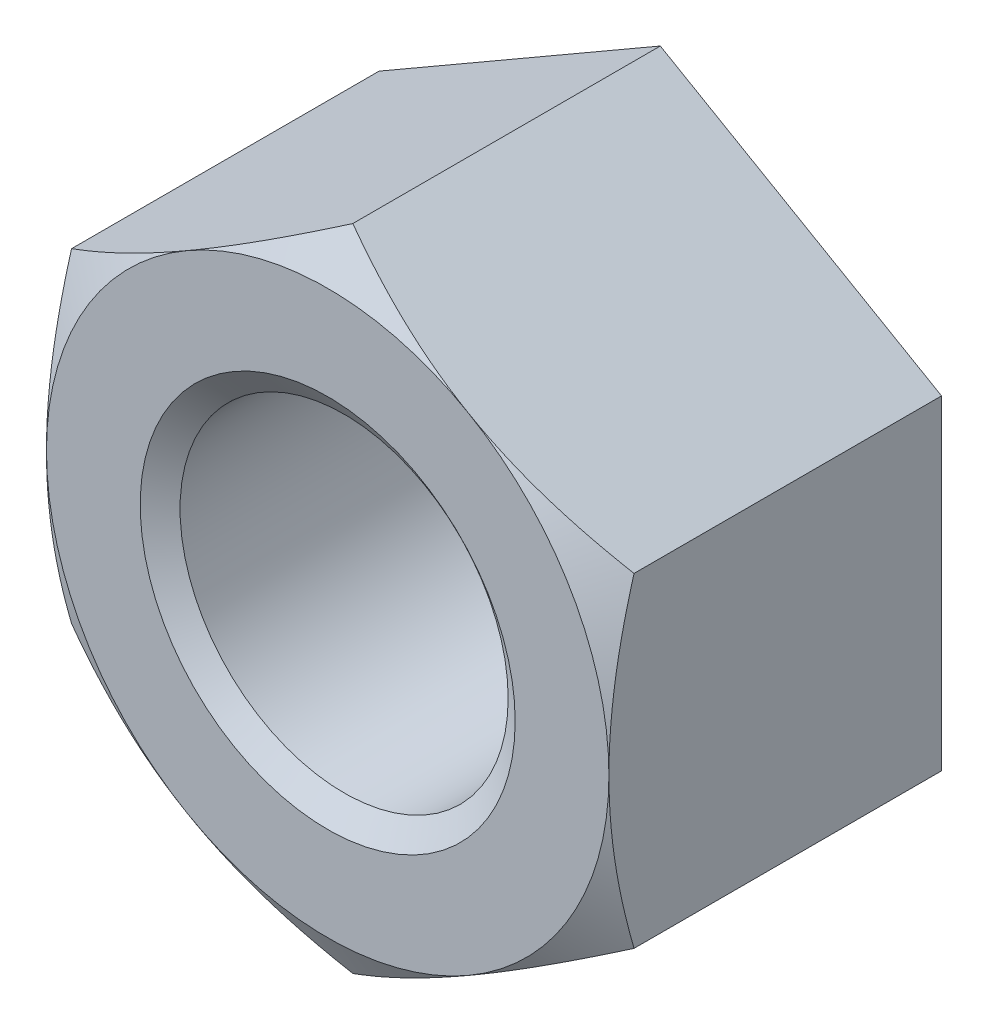
ISO-10303-21;
HEADER;
FILE_DESCRIPTION(('STEP AP214'),'2;1');
FILE_NAME('part.step','',(''),(''),'','','');
FILE_SCHEMA(('AUTOMOTIVE_DESIGN { 1 0 10303 214 1 1 1 1 }'));
ENDSEC;
DATA;
#1=APPLICATION_CONTEXT('core data for automotive mechanical design processes');
#2=APPLICATION_PROTOCOL_DEFINITION('international standard','automotive_design',2000,#1);
#3=PRODUCT_CONTEXT('',#1,'mechanical');
#4=PRODUCT('Part','Part','',(#3));
#5=PRODUCT_RELATED_PRODUCT_CATEGORY('part','',(#4));
#6=PRODUCT_DEFINITION_FORMATION('','',#4);
#7=PRODUCT_DEFINITION_CONTEXT('part definition',#1,'design');
#8=PRODUCT_DEFINITION('design','',#6,#7);
#9=PRODUCT_DEFINITION_SHAPE('','',#8);
#10=(LENGTH_UNIT() NAMED_UNIT(*) SI_UNIT(.MILLI.,.METRE.));
#11=(NAMED_UNIT(*) PLANE_ANGLE_UNIT() SI_UNIT($,.RADIAN.));
#12=(NAMED_UNIT(*) SI_UNIT($,.STERADIAN.) SOLID_ANGLE_UNIT());
#13=UNCERTAINTY_MEASURE_WITH_UNIT(LENGTH_MEASURE(1.E-05),#10,'distance_accuracy_value','');
#14=(GEOMETRIC_REPRESENTATION_CONTEXT(3) GLOBAL_UNCERTAINTY_ASSIGNED_CONTEXT((#13)) GLOBAL_UNIT_ASSIGNED_CONTEXT((#10,
#11,#12)) REPRESENTATION_CONTEXT('',''));
#15=CARTESIAN_POINT('',(0.,0.,0.));
#16=DIRECTION('',(0.,0.,1.));
#17=DIRECTION('',(1.,0.,0.));
#18=AXIS2_PLACEMENT_3D('',#15,#16,#17);
#19=CARTESIAN_POINT('',(0.,0.,-22.5298));
#20=DIRECTION('',(0.,0.,1.));
#21=DIRECTION('',(1.,0.,0.));
#22=AXIS2_PLACEMENT_3D('',#19,#20,#21);
#23=CYLINDRICAL_SURFACE('',#22,11.1125);
#24=CARTESIAN_POINT('',(0.,0.,-1.11157946690791));
#25=DIRECTION('',(0.,0.,1.));
#26=DIRECTION('',(1.,0.,0.));
#27=AXIS2_PLACEMENT_3D('',#24,#25,#26);
#28=CIRCLE('',#27,11.1125);
#29=CARTESIAN_POINT('',(11.1125,0.,-1.11157946690791));
#30=VERTEX_POINT('',#29);
#31=EDGE_CURVE('E129',#30,#30,#28,.F.);
#32=ORIENTED_EDGE('',*,*,#31,.F.);
#33=EDGE_LOOP('',(#32));
#34=FACE_BOUND('',#33,.T.);
#35=CARTESIAN_POINT('',(0.,0.,-21.3928205330921));
#36=DIRECTION('',(0.,0.,-1.));
#37=DIRECTION('',(-1.,0.,0.));
#38=AXIS2_PLACEMENT_3D('',#35,#36,#37);
#39=CIRCLE('',#38,11.1125);
#40=CARTESIAN_POINT('',(-11.1125,0.,-21.3928205330921));
#41=VERTEX_POINT('',#40);
#42=EDGE_CURVE('E39',#41,#41,#39,.F.);
#43=ORIENTED_EDGE('',*,*,#42,.F.);
#44=EDGE_LOOP('',(#43));
#45=FACE_BOUND('',#44,.T.);
#46=ADVANCED_FACE('F34',(#34,#45),#23,.F.);
#47=CARTESIAN_POINT('',(0.,21.9970452561248,-22.5298));
#48=DIRECTION('',(-0.500000000000001,0.866025403784438,0.));
#49=DIRECTION('',(-0.866025403784438,-0.500000000000001,0.));
#50=AXIS2_PLACEMENT_3D('',#47,#48,#49);
#51=PLANE('',#50);
#52=DIRECTION('',(0.,0.,1.));
#53=VECTOR('',#52,1.);
#54=CARTESIAN_POINT('',(-19.05,10.9985226280624,-22.5298));
#55=LINE('',#54,#53);
#56=CARTESIAN_POINT('',(-19.05,10.9985226280624,-22.5298));
#57=VERTEX_POINT('',#56);
#58=CARTESIAN_POINT('',(-19.05,10.9985226280624,-1.70147737193762));
#59=VERTEX_POINT('',#58);
#60=EDGE_CURVE('E235',#57,#59,#55,.T.);
#61=ORIENTED_EDGE('',*,*,#60,.T.);
#62=CARTESIAN_POINT('',(-19.0502,10.9984071580085,-1.70154403912922));
#63=CARTESIAN_POINT('',(-18.6314889424188,11.2401500998157,-1.56198341710823));
#64=CARTESIAN_POINT('',(-18.2111446870423,11.4828359688097,-1.42875584552932));
#65=CARTESIAN_POINT('',(-17.3670855155916,11.9701537586587,-1.17672716507821));
#66=CARTESIAN_POINT('',(-16.9433695394589,12.2147862915388,-1.05793080103127));
#67=CARTESIAN_POINT('',(-16.0917480208183,12.7064702045736,-0.836361403470761));
#68=CARTESIAN_POINT('',(-15.6638350258304,12.9535258874196,-0.733626282713286));
#69=CARTESIAN_POINT('',(-14.8050356703556,13.4493539264829,-0.54638543408781));
#70=CARTESIAN_POINT('',(-14.374149481613,13.6981261835436,-0.461878662220414));
#71=CARTESIAN_POINT('',(-13.5204444881885,14.1910129913057,-0.314688827717638));
#72=CARTESIAN_POINT('',(-13.0976890621094,14.4350909503539,-0.2515185920053));
#73=CARTESIAN_POINT('',(-12.250241089937,14.9243652652118,-0.145596345015129));
#74=CARTESIAN_POINT('',(-11.8255485067157,15.1695616424575,-0.102844726760489));
#75=CARTESIAN_POINT('',(-10.9754499399404,15.6603662788229,-0.0388391678998634));
#76=CARTESIAN_POINT('',(-10.5500454086646,15.9059736994695,-0.0175596817216179));
#77=CARTESIAN_POINT('',(-9.6988436900556,16.397415240843,0.00304398488097226));
#78=CARTESIAN_POINT('',(-9.27304651526214,16.6432493543302,0.00236884372942893));
#79=CARTESIAN_POINT('',(-8.47700964232625,17.1028414572046,-0.0194033988503004));
#80=CARTESIAN_POINT('',(-8.10671322507253,17.316632193386,-0.0378455699352581));
#81=CARTESIAN_POINT('',(-7.36700369103291,17.7437036919859,-0.0909844304102484));
#82=CARTESIAN_POINT('',(-6.99759056167259,17.9569844616643,-0.125680887003944));
#83=CARTESIAN_POINT('',(-6.25978756382388,18.3829552210812,-0.210726274890312));
#84=CARTESIAN_POINT('',(-5.89139892582437,18.5956445003966,-0.261089360566665));
#85=CARTESIAN_POINT('',(-5.15637533457961,19.0200105686625,-0.376579300829338));
#86=CARTESIAN_POINT('',(-4.78974037391031,19.2316873618992,-0.441706092858125));
#87=CARTESIAN_POINT('',(-3.67677271593589,19.8742595388301,-0.660888399543253));
#88=CARTESIAN_POINT('',(-2.93366305060603,20.3032941041457,-0.836799169320445));
#89=CARTESIAN_POINT('',(-1.45852420538159,21.1549659135281,-1.23604434094318));
#90=CARTESIAN_POINT('',(-0.726476139694541,21.5776140613123,-1.45928498251532));
#91=CARTESIAN_POINT('',(0.000200000000000728,21.9971607261786,-1.70154403912923));
#92=B_SPLINE_CURVE_WITH_KNOTS('',3,(#62,#63,#64,#65,#66,#67,#68,#69,#70,#71,#72,#73,#74,#75,#76,
#77,#78,#79,#80,#81,#82,#83,#84,#85,#86,#87,#88,#89,#90,#91),.UNSPECIFIED.,.F.,.F.,(4,2,2,2,2,2,
2,2,2,2,2,2,2,2,4),(0.,1.50971559281794,3.01992622800797,4.53364959201314,6.04728623691164,
7.52356313869613,8.99986845512143,10.4744153207586,11.9489166211861,13.2325441548787,
14.5161533048254,15.8009255464228,17.085692344219,19.7118183650732,22.3327898553892),.UNSPECIFIED.);
#93=CARTESIAN_POINT('',(-9.52500000000002,16.4977839420936,0.));
#94=VERTEX_POINT('',#93);
#95=EDGE_CURVE('E61',#59,#94,#92,.T.);
#96=ORIENTED_EDGE('',*,*,#95,.T.);
#97=CARTESIAN_POINT('',(0.,21.9970452561248,-1.70147737193764));
#98=VERTEX_POINT('',#97);
#99=EDGE_CURVE('E121',#94,#98,#92,.T.);
#100=ORIENTED_EDGE('',*,*,#99,.T.);
#101=DIRECTION('',(0.,0.,1.));
#102=VECTOR('',#101,1.);
#103=CARTESIAN_POINT('',(0.,21.9970452561248,-22.5298));
#104=LINE('',#103,#102);
#105=CARTESIAN_POINT('',(0.,21.9970452561248,-22.5298));
#106=VERTEX_POINT('',#105);
#107=EDGE_CURVE('E134',#106,#98,#104,.T.);
#108=ORIENTED_EDGE('',*,*,#107,.F.);
#109=DIRECTION('',(-0.866025403784438,-0.500000000000001,0.));
#110=VECTOR('',#109,1.);
#111=CARTESIAN_POINT('',(0.,21.9970452561248,-22.5298));
#112=LINE('',#111,#110);
#113=EDGE_CURVE('E135',#106,#57,#112,.T.);
#114=ORIENTED_EDGE('',*,*,#113,.T.);
#115=EDGE_LOOP('',(#61,#96,#100,#108,#114));
#116=FACE_BOUND('',#115,.T.);
#117=ADVANCED_FACE('F36',(#116),#51,.T.);
#118=CARTESIAN_POINT('',(19.05,10.9985226280624,-22.5298));
#119=DIRECTION('',(0.500000000000001,0.866025403784438,0.));
#120=DIRECTION('',(-0.866025403784438,0.500000000000001,0.));
#121=AXIS2_PLACEMENT_3D('',#118,#119,#120);
#122=PLANE('',#121);
#123=ORIENTED_EDGE('',*,*,#107,.T.);
#124=CARTESIAN_POINT('',(-0.000200000000000468,21.9971607261786,-1.70154403912923));
#125=CARTESIAN_POINT('',(0.418511057581223,21.7554177843714,-1.56198341710824));
#126=CARTESIAN_POINT('',(0.83885531295774,21.5127319153775,-1.42875584552934));
#127=CARTESIAN_POINT('',(1.68291448440842,21.0254141255284,-1.17672716507822));
#128=CARTESIAN_POINT('',(2.10663046054107,20.7807815926483,-1.05793080103129));
#129=CARTESIAN_POINT('',(2.95825197918165,20.2890976796135,-0.83636140347077));
#130=CARTESIAN_POINT('',(3.38616497416957,20.0420419967675,-0.733626282713294));
#131=CARTESIAN_POINT('',(4.24496432964444,19.5462139577042,-0.546385434087818));
#132=CARTESIAN_POINT('',(4.67585051838703,19.2974417006435,-0.461878662220422));
#133=CARTESIAN_POINT('',(5.52955551181151,18.8045548928814,-0.314688827717644));
#134=CARTESIAN_POINT('',(5.95231093789063,18.5604769338332,-0.251518592005304));
#135=CARTESIAN_POINT('',(6.79975891006299,18.0712026189753,-0.145596345015133));
#136=CARTESIAN_POINT('',(7.22445149328435,17.8260062417296,-0.102844726760493));
#137=CARTESIAN_POINT('',(8.07455006005964,17.3352016053642,-0.0388391678998658));
#138=CARTESIAN_POINT('',(8.49995459133542,17.0895941847176,-0.0175596817216192));
#139=CARTESIAN_POINT('',(9.35115630994441,16.5981526433441,0.00304398488097248));
#140=CARTESIAN_POINT('',(9.77695348473788,16.3523185298569,0.00236884372942956));
#141=CARTESIAN_POINT('',(10.5729903576738,15.8927264269825,-0.0194033988502991));
#142=CARTESIAN_POINT('',(10.9432867749275,15.6789356908011,-0.0378455699352566));
#143=CARTESIAN_POINT('',(11.6829963089671,15.2518641922012,-0.0909844304102459));
#144=CARTESIAN_POINT('',(12.0524094383274,15.0385834225228,-0.12568088700394));
#145=CARTESIAN_POINT('',(12.7902124361761,14.612612663106,-0.210726274890308));
#146=CARTESIAN_POINT('',(13.1586010741756,14.3999233837905,-0.261089360566661));
#147=CARTESIAN_POINT('',(13.8936246654204,13.9755573155246,-0.376579300829333));
#148=CARTESIAN_POINT('',(14.2602596260897,13.7638805222879,-0.441706092858118));
#149=CARTESIAN_POINT('',(15.3732272840641,13.121308345357,-0.660888399543242));
#150=CARTESIAN_POINT('',(16.116336949394,12.6922737800414,-0.836799169320435));
#151=CARTESIAN_POINT('',(17.5914757946184,11.840601970659,-1.23604434094317));
#152=CARTESIAN_POINT('',(18.3235238603055,11.4179538228748,-1.45928498251531));
#153=CARTESIAN_POINT('',(19.0502,10.9984071580085,-1.70154403912922));
#154=B_SPLINE_CURVE_WITH_KNOTS('',3,(#124,#125,#126,#127,#128,#129,#130,#131,#132,#133,#134,
#135,#136,#137,#138,#139,#140,#141,#142,#143,#144,#145,#146,#147,#148,#149,#150,#151,#152,#153),
.UNSPECIFIED.,.F.,.F.,(4,2,2,2,2,2,2,2,2,2,2,2,2,2,4),(0.,1.50971559281794,3.01992622800797,
4.53364959201314,6.04728623691164,7.52356313869614,8.99986845512144,10.4744153207586,
11.9489166211862,13.2325441548787,14.5161533048254,15.8009255464228,17.085692344219,
19.7118183650732,22.3327898553892),.UNSPECIFIED.);
#155=CARTESIAN_POINT('',(9.52500000000002,16.4977839420936,0.));
#156=VERTEX_POINT('',#155);
#157=EDGE_CURVE('E116',#98,#156,#154,.T.);
#158=ORIENTED_EDGE('',*,*,#157,.T.);
#159=CARTESIAN_POINT('',(19.05,10.9985226280624,-1.70147737193764));
#160=VERTEX_POINT('',#159);
#161=EDGE_CURVE('E108',#156,#160,#154,.T.);
#162=ORIENTED_EDGE('',*,*,#161,.T.);
#163=DIRECTION('',(0.,0.,1.));
#164=VECTOR('',#163,1.);
#165=CARTESIAN_POINT('',(19.05,10.9985226280624,-22.5298));
#166=LINE('',#165,#164);
#167=CARTESIAN_POINT('',(19.05,10.9985226280624,-22.5298));
#168=VERTEX_POINT('',#167);
#169=EDGE_CURVE('E247',#168,#160,#166,.T.);
#170=ORIENTED_EDGE('',*,*,#169,.F.);
#171=DIRECTION('',(-0.866025403784438,0.500000000000001,0.));
#172=VECTOR('',#171,1.);
#173=CARTESIAN_POINT('',(19.05,10.9985226280624,-22.5298));
#174=LINE('',#173,#172);
#175=EDGE_CURVE('E239',#168,#106,#174,.T.);
#176=ORIENTED_EDGE('',*,*,#175,.T.);
#177=EDGE_LOOP('',(#123,#158,#162,#170,#176));
#178=FACE_BOUND('',#177,.T.);
#179=ADVANCED_FACE('F132',(#178),#122,.T.);
#180=CARTESIAN_POINT('',(19.05,10.9985226280624,-22.5298));
#181=DIRECTION('',(-1.,0.,0.));
#182=DIRECTION('',(0.,0.,1.));
#183=AXIS2_PLACEMENT_3D('',#180,#181,#182);
#184=PLANE('',#183);
#185=CARTESIAN_POINT('',(19.05,-29.169702852179,-9.11593373615838));
#186=CARTESIAN_POINT('',(19.05,-28.7515170158437,-8.91378890432751));
#187=CARTESIAN_POINT('',(19.05,-28.3328257173085,-8.71269026117987));
#188=CARTESIAN_POINT('',(19.05,-27.494325409167,-8.31282549081004));
#189=CARTESIAN_POINT('',(19.05,-27.0745163873414,-8.11405938921733));
#190=CARTESIAN_POINT('',(19.05,-25.813129635616,-7.52156252646635));
#191=CARTESIAN_POINT('',(19.05,-24.9697281338906,-7.13169909625408));
#192=CARTESIAN_POINT('',(19.05,-23.2722707252134,-6.36257122322556));
#193=CARTESIAN_POINT('',(19.05,-22.4181814672043,-5.983380201443));
#194=CARTESIAN_POINT('',(19.05,-20.7029839633497,-5.24127883376426));
#195=CARTESIAN_POINT('',(19.05,-19.8418760858487,-4.87836763990463));
#196=CARTESIAN_POINT('',(19.05,-18.1005821949281,-4.16885698892379));
#197=CARTESIAN_POINT('',(19.05,-17.2202917493445,-3.82251248896517));
#198=CARTESIAN_POINT('',(19.05,-15.4493217028707,-3.15694792805771));
#199=CARTESIAN_POINT('',(19.05,-14.5586409597487,-2.83773088187276));
#200=CARTESIAN_POINT('',(19.05,-12.7673320093036,-2.23500280836709));
#201=CARTESIAN_POINT('',(19.05,-11.8667295562314,-1.95141586644078));
#202=CARTESIAN_POINT('',(19.05,-10.0526343476905,-1.4291439223064));
#203=CARTESIAN_POINT('',(19.05,-9.13914576283874,-1.19044473497907));
#204=CARTESIAN_POINT('',(19.05,-7.75907469613669,-0.87479986463958));
#205=CARTESIAN_POINT('',(19.05,-7.29731333096125,-0.77663607230068));
#206=CARTESIAN_POINT('',(19.05,-6.37071732035876,-0.595993194228058));
#207=CARTESIAN_POINT('',(19.05,-5.90588274419356,-0.513513756249889));
#208=CARTESIAN_POINT('',(19.05,-4.97345228347656,-0.365701829763007));
#209=CARTESIAN_POINT('',(19.05,-4.50585623113596,-0.300370394368067));
#210=CARTESIAN_POINT('',(19.05,-3.56843861997924,-0.188166673467613));
#211=CARTESIAN_POINT('',(19.05,-3.09861705851875,-0.141294409901031));
#212=CARTESIAN_POINT('',(19.05,-2.16041609237781,-0.0672708899891387));
#213=CARTESIAN_POINT('',(19.05,-1.69204648745221,-0.039996240021869));
#214=CARTESIAN_POINT('',(19.05,-0.754574655686934,-0.00531133514657459));
#215=CARTESIAN_POINT('',(19.05,-0.285472440023939,0.00209921990146241));
#216=CARTESIAN_POINT('',(19.05,0.652492903955205,-0.00311981807029286));
#217=CARTESIAN_POINT('',(19.05,1.12135606251189,-0.0157438674170579));
#218=CARTESIAN_POINT('',(19.05,2.05813737693965,-0.0607182138392642));
#219=CARTESIAN_POINT('',(19.05,2.52605549030135,-0.0930693792758735));
#220=CARTESIAN_POINT('',(19.05,3.65980250445305,-0.194680098436448));
#221=CARTESIAN_POINT('',(19.05,4.32476458495625,-0.273803719903592));
#222=CARTESIAN_POINT('',(19.05,5.64947952989345,-0.467485362814413));
#223=CARTESIAN_POINT('',(19.05,6.30923160661032,-0.582048641146117));
#224=CARTESIAN_POINT('',(19.05,8.28182382190531,-0.973151819996955));
#225=CARTESIAN_POINT('',(19.05,9.58542312013704,-1.29684470280669));
#226=CARTESIAN_POINT('',(19.05,11.5353898831337,-1.85499845441048));
#227=CARTESIAN_POINT('',(19.05,12.191945455476,-2.05588340149063));
#228=CARTESIAN_POINT('',(19.05,13.498713616712,-2.47768236405905));
#229=CARTESIAN_POINT('',(19.05,14.1489256271383,-2.69859818759323));
#230=CARTESIAN_POINT('',(19.05,15.439765608065,-3.15575174176009));
#231=CARTESIAN_POINT('',(19.05,16.0804269482461,-3.39189604004687));
#232=CARTESIAN_POINT('',(19.05,17.0373840365627,-3.75633654034205));
#233=CARTESIAN_POINT('',(19.05,17.3556458209396,-3.87949985759098));
#234=CARTESIAN_POINT('',(19.05,17.9909330309769,-4.12895791785129));
#235=CARTESIAN_POINT('',(19.05,18.3079584810038,-4.25525259878292));
#236=CARTESIAN_POINT('',(19.05,18.6244086642405,-4.38297164365514));
#237=B_SPLINE_CURVE_WITH_KNOTS('',3,(#185,#186,#187,#188,#189,#190,#191,#192,#193,#194,#195,
#196,#197,#198,#199,#200,#201,#202,#203,#204,#205,#206,#207,#208,#209,#210,#211,#212,#213,#214,
#215,#216,#217,#218,#219,#220,#221,#222,#223,#224,#225,#226,#227,#228,#229,#230,#231,#232,#233,
#234,#235,#236),.UNSPECIFIED.,.F.,.F.,(4,2,2,2,2,2,2,2,2,2,2,2,2,2,2,2,2,2,2,2,2,2,2,2,2,4),(0.,
1.39343811466813,2.78689152584545,5.57425145066782,8.37756231436866,11.1807269927528,
14.0183059326613,16.856199810853,19.6879407755784,22.5187853636699,23.934802353684,
25.3507875385607,26.766859663288,28.1829334710278,29.5900111205978,30.9970675095625,
32.4037346270206,33.8104636685473,35.8182820070619,37.8263983152062,41.8503661996048,
43.910005496493,45.9698308879145,48.018040072954,49.0418117683235,50.0655631834717),.UNSPECIFIED.);
#238=CARTESIAN_POINT('',(19.05,-10.9985226280624,-1.70147737193764));
#239=VERTEX_POINT('',#238);
#240=CARTESIAN_POINT('',(19.05,0.,0.));
#241=VERTEX_POINT('',#240);
#242=EDGE_CURVE('E183',#239,#241,#237,.T.);
#243=ORIENTED_EDGE('',*,*,#242,.F.);
#244=DIRECTION('',(0.,0.,1.));
#245=VECTOR('',#244,1.);
#246=CARTESIAN_POINT('',(19.05,-10.9985226280624,-22.5298));
#247=LINE('',#246,#245);
#248=CARTESIAN_POINT('',(19.05,-10.9985226280624,-22.5298));
#249=VERTEX_POINT('',#248);
#250=EDGE_CURVE('E244',#249,#239,#247,.T.);
#251=ORIENTED_EDGE('',*,*,#250,.F.);
#252=DIRECTION('',(0.,-1.,0.));
#253=VECTOR('',#252,1.);
#254=CARTESIAN_POINT('',(19.05,10.9985226280624,-22.5298));
#255=LINE('',#254,#253);
#256=EDGE_CURVE('E251',#168,#249,#255,.T.);
#257=ORIENTED_EDGE('',*,*,#256,.F.);
#258=ORIENTED_EDGE('',*,*,#169,.T.);
#259=EDGE_CURVE('E112',#241,#160,#237,.T.);
#260=ORIENTED_EDGE('',*,*,#259,.F.);
#261=EDGE_LOOP('',(#243,#251,#257,#258,#260));
#262=FACE_BOUND('',#261,.T.);
#263=ADVANCED_FACE('F188',(#262),#184,.F.);
#264=CARTESIAN_POINT('',(0.,-21.9970452561248,-22.5298));
#265=DIRECTION('',(0.500000000000001,-0.866025403784438,0.));
#266=DIRECTION('',(0.866025403784438,0.500000000000001,0.));
#267=AXIS2_PLACEMENT_3D('',#264,#265,#266);
#268=PLANE('',#267);
#269=ORIENTED_EDGE('',*,*,#250,.T.);
#270=CARTESIAN_POINT('',(19.0502,-10.9984071580086,-1.70154403912923));
#271=CARTESIAN_POINT('',(18.6314889424188,-11.2401500998158,-1.56198341710824));
#272=CARTESIAN_POINT('',(18.2111446870423,-11.4828359688097,-1.42875584552934));
#273=CARTESIAN_POINT('',(17.3670855155916,-11.9701537586587,-1.17672716507822));
#274=CARTESIAN_POINT('',(16.9433695394589,-12.2147862915389,-1.05793080103129));
#275=CARTESIAN_POINT('',(16.0917480208183,-12.7064702045737,-0.836361403470775));
#276=CARTESIAN_POINT('',(15.6638350258304,-12.9535258874197,-0.733626282713301));
#277=CARTESIAN_POINT('',(14.8050356703556,-13.449353926483,-0.546385434087827));
#278=CARTESIAN_POINT('',(14.374149481613,-13.6981261835436,-0.46187866222043));
#279=CARTESIAN_POINT('',(13.5204444881885,-14.1910129913058,-0.314688827717654));
#280=CARTESIAN_POINT('',(13.0976890621094,-14.4350909503539,-0.251518592005318));
#281=CARTESIAN_POINT('',(12.250241089937,-14.9243652652118,-0.145596345015148));
#282=CARTESIAN_POINT('',(11.8255485067156,-15.1695616424575,-0.102844726760508));
#283=CARTESIAN_POINT('',(10.9754499399404,-15.660366278823,-0.0388391678998835));
#284=CARTESIAN_POINT('',(10.5500454086646,-15.9059736994695,-0.0175596817216396));
#285=CARTESIAN_POINT('',(9.69884369005559,-16.3974152408431,0.00304398488094793));
#286=CARTESIAN_POINT('',(9.27304651526212,-16.6432493543303,0.00236884372940359));
#287=CARTESIAN_POINT('',(8.47700964232624,-17.1028414572047,-0.0194033988503261));
#288=CARTESIAN_POINT('',(8.10671322507251,-17.3166321933861,-0.0378455699352835));
#289=CARTESIAN_POINT('',(7.36700369103289,-17.743703691986,-0.090984430410274));
#290=CARTESIAN_POINT('',(6.99759056167258,-17.9569844616643,-0.12568088700397));
#291=CARTESIAN_POINT('',(6.25978756382387,-18.3829552210812,-0.210726274890339));
#292=CARTESIAN_POINT('',(5.89139892582436,-18.5956445003966,-0.261089360566693));
#293=CARTESIAN_POINT('',(5.1563753345796,-19.0200105686625,-0.376579300829367));
#294=CARTESIAN_POINT('',(4.7897403739103,-19.2316873618993,-0.441706092858153));
#295=CARTESIAN_POINT('',(3.67677271593589,-19.8742595388301,-0.660888399543281));
#296=CARTESIAN_POINT('',(2.93366305060603,-20.3032941041457,-0.836799169320473));
#297=CARTESIAN_POINT('',(1.45852420538159,-21.1549659135282,-1.23604434094321));
#298=CARTESIAN_POINT('',(0.726476139694538,-21.5776140613123,-1.45928498251535));
#299=CARTESIAN_POINT('',(-0.000200000000001911,-21.9971607261786,-1.70154403912926));
#300=B_SPLINE_CURVE_WITH_KNOTS('',3,(#270,#271,#272,#273,#274,#275,#276,#277,#278,#279,#280,
#281,#282,#283,#284,#285,#286,#287,#288,#289,#290,#291,#292,#293,#294,#295,#296,#297,#298,#299),
.UNSPECIFIED.,.F.,.F.,(4,2,2,2,2,2,2,2,2,2,2,2,2,2,4),(0.,1.50971559281795,3.01992622800797,
4.53364959201314,6.04728623691164,7.52356313869614,8.99986845512144,10.4744153207586,
11.9489166211862,13.2325441548787,14.5161533048254,15.8009255464228,17.085692344219,
19.7118183650732,22.3327898553892),.UNSPECIFIED.);
#301=CARTESIAN_POINT('',(9.52500000000003,-16.4977839420935,0.));
#302=VERTEX_POINT('',#301);
#303=EDGE_CURVE('E187',#239,#302,#300,.T.);
#304=ORIENTED_EDGE('',*,*,#303,.T.);
#305=CARTESIAN_POINT('',(0.,-21.9970452561248,-1.70147737193764));
#306=VERTEX_POINT('',#305);
#307=EDGE_CURVE('E178',#302,#306,#300,.T.);
#308=ORIENTED_EDGE('',*,*,#307,.T.);
#309=DIRECTION('',(0.,0.,1.));
#310=VECTOR('',#309,1.);
#311=CARTESIAN_POINT('',(0.,-21.9970452561248,-22.5298));
#312=LINE('',#311,#310);
#313=CARTESIAN_POINT('',(0.,-21.9970452561248,-22.5298));
#314=VERTEX_POINT('',#313);
#315=EDGE_CURVE('E241',#314,#306,#312,.T.);
#316=ORIENTED_EDGE('',*,*,#315,.F.);
#317=DIRECTION('',(0.866025403784438,0.500000000000001,0.));
#318=VECTOR('',#317,1.);
#319=CARTESIAN_POINT('',(0.,-21.9970452561248,-22.5298));
#320=LINE('',#319,#318);
#321=EDGE_CURVE('E253',#314,#249,#320,.T.);
#322=ORIENTED_EDGE('',*,*,#321,.T.);
#323=EDGE_LOOP('',(#269,#304,#308,#316,#322));
#324=FACE_BOUND('',#323,.T.);
#325=ADVANCED_FACE('F191',(#324),#268,.T.);
#326=CARTESIAN_POINT('',(-19.05,-10.9985226280624,-22.5298));
#327=DIRECTION('',(-0.500000000000001,-0.866025403784438,0.));
#328=DIRECTION('',(0.866025403784438,-0.500000000000001,0.));
#329=AXIS2_PLACEMENT_3D('',#326,#327,#328);
#330=PLANE('',#329);
#331=ORIENTED_EDGE('',*,*,#315,.T.);
#332=CARTESIAN_POINT('',(0.000199999999998265,-21.9971607261786,-1.70154403912926));
#333=CARTESIAN_POINT('',(-0.418511057581224,-21.7554177843715,-1.56198341710827));
#334=CARTESIAN_POINT('',(-0.838855312957742,-21.5127319153775,-1.42875584552937));
#335=CARTESIAN_POINT('',(-1.68291448440842,-21.0254141255285,-1.17672716507825));
#336=CARTESIAN_POINT('',(-2.10663046054108,-20.7807815926484,-1.05793080103131));
#337=CARTESIAN_POINT('',(-2.95825197918166,-20.2890976796135,-0.836361403470799));
#338=CARTESIAN_POINT('',(-3.38616497416957,-20.0420419967675,-0.733626282713323));
#339=CARTESIAN_POINT('',(-4.24496432964445,-19.5462139577042,-0.546385434087845));
#340=CARTESIAN_POINT('',(-4.67585051838704,-19.2974417006436,-0.461878662220448));
#341=CARTESIAN_POINT('',(-5.52955551181152,-18.8045548928814,-0.31468882771767));
#342=CARTESIAN_POINT('',(-5.95231093789064,-18.5604769338333,-0.251518592005331));
#343=CARTESIAN_POINT('',(-6.79975891006301,-18.0712026189754,-0.145596345015158));
#344=CARTESIAN_POINT('',(-7.22445149328437,-17.8260062417297,-0.102844726760517));
#345=CARTESIAN_POINT('',(-8.07455006005966,-17.3352016053642,-0.0388391678998899));
#346=CARTESIAN_POINT('',(-8.49995459133544,-17.0895941847177,-0.0175596817216445));
#347=CARTESIAN_POINT('',(-9.35115630994443,-16.5981526433441,0.0030439848809458));
#348=CARTESIAN_POINT('',(-9.7769534847379,-16.3523185298569,0.00236884372940272));
#349=CARTESIAN_POINT('',(-10.5729903576738,-15.8927264269825,-0.0194033988503253));
#350=CARTESIAN_POINT('',(-10.9432867749275,-15.6789356908011,-0.037845569935282));
#351=CARTESIAN_POINT('',(-11.6829963089671,-15.2518641922012,-0.09098443041027));
#352=CARTESIAN_POINT('',(-12.0524094383274,-15.0385834225229,-0.125680887003964));
#353=CARTESIAN_POINT('',(-12.7902124361761,-14.612612663106,-0.210726274890332));
#354=CARTESIAN_POINT('',(-13.1586010741756,-14.3999233837906,-0.261089360566685));
#355=CARTESIAN_POINT('',(-13.8936246654204,-13.9755573155247,-0.376579300829357));
#356=CARTESIAN_POINT('',(-14.2602596260897,-13.7638805222879,-0.441706092858141));
#357=CARTESIAN_POINT('',(-15.3732272840641,-13.1213083453571,-0.660888399543263));
#358=CARTESIAN_POINT('',(-16.116336949394,-12.6922737800415,-0.836799169320454));
#359=CARTESIAN_POINT('',(-17.5914757946184,-11.840601970659,-1.23604434094319));
#360=CARTESIAN_POINT('',(-18.3235238603055,-11.4179538228749,-1.45928498251532));
#361=CARTESIAN_POINT('',(-19.0502,-10.9984071580086,-1.70154403912924));
#362=B_SPLINE_CURVE_WITH_KNOTS('',3,(#332,#333,#334,#335,#336,#337,#338,#339,#340,#341,#342,
#343,#344,#345,#346,#347,#348,#349,#350,#351,#352,#353,#354,#355,#356,#357,#358,#359,#360,#361),
.UNSPECIFIED.,.F.,.F.,(4,2,2,2,2,2,2,2,2,2,2,2,2,2,4),(0.,1.50971559281794,3.01992622800797,
4.53364959201315,6.04728623691166,7.52356313869616,8.99986845512146,10.4744153207587,
11.9489166211862,13.2325441548787,14.5161533048255,15.8009255464228,17.085692344219,
19.7118183650732,22.3327898553892),.UNSPECIFIED.);
#363=CARTESIAN_POINT('',(-9.52500000000003,-16.4977839420935,0.));
#364=VERTEX_POINT('',#363);
#365=EDGE_CURVE('E275',#306,#364,#362,.T.);
#366=ORIENTED_EDGE('',*,*,#365,.T.);
#367=CARTESIAN_POINT('',(-19.05,-10.9985226280624,-1.70147737193764));
#368=VERTEX_POINT('',#367);
#369=EDGE_CURVE('E171',#364,#368,#362,.T.);
#370=ORIENTED_EDGE('',*,*,#369,.T.);
#371=DIRECTION('',(0.,0.,1.));
#372=VECTOR('',#371,1.);
#373=CARTESIAN_POINT('',(-19.05,-10.9985226280624,-22.5298));
#374=LINE('',#373,#372);
#375=CARTESIAN_POINT('',(-19.05,-10.9985226280624,-22.5298));
#376=VERTEX_POINT('',#375);
#377=EDGE_CURVE('E238',#376,#368,#374,.T.);
#378=ORIENTED_EDGE('',*,*,#377,.F.);
#379=DIRECTION('',(0.866025403784438,-0.500000000000001,0.));
#380=VECTOR('',#379,1.);
#381=CARTESIAN_POINT('',(-19.05,-10.9985226280624,-22.5298));
#382=LINE('',#381,#380);
#383=EDGE_CURVE('E256',#376,#314,#382,.T.);
#384=ORIENTED_EDGE('',*,*,#383,.T.);
#385=EDGE_LOOP('',(#331,#366,#370,#378,#384));
#386=FACE_BOUND('',#385,.T.);
#387=ADVANCED_FACE('F195',(#386),#330,.T.);
#388=CARTESIAN_POINT('',(-19.05,10.9985226280624,-22.5298));
#389=DIRECTION('',(-1.,0.,0.));
#390=DIRECTION('',(0.,0.,1.));
#391=AXIS2_PLACEMENT_3D('',#388,#389,#390);
#392=PLANE('',#391);
#393=ORIENTED_EDGE('',*,*,#377,.T.);
#394=CARTESIAN_POINT('',(-19.05,-29.169702852179,-9.11593373615838));
#395=CARTESIAN_POINT('',(-19.05,-28.7515170158437,-8.91378890432751));
#396=CARTESIAN_POINT('',(-19.05,-28.3328257173085,-8.71269026117987));
#397=CARTESIAN_POINT('',(-19.05,-27.494325409167,-8.31282549081004));
#398=CARTESIAN_POINT('',(-19.05,-27.0745163873414,-8.11405938921733));
#399=CARTESIAN_POINT('',(-19.05,-25.813129635616,-7.52156252646635));
#400=CARTESIAN_POINT('',(-19.05,-24.9697281338906,-7.13169909625408));
#401=CARTESIAN_POINT('',(-19.05,-23.2722707252134,-6.36257122322556));
#402=CARTESIAN_POINT('',(-19.05,-22.4181814672043,-5.983380201443));
#403=CARTESIAN_POINT('',(-19.05,-20.7029839633497,-5.24127883376426));
#404=CARTESIAN_POINT('',(-19.05,-19.8418760858487,-4.87836763990464));
#405=CARTESIAN_POINT('',(-19.05,-18.1005821949281,-4.1688569889238));
#406=CARTESIAN_POINT('',(-19.05,-17.2202917493445,-3.82251248896517));
#407=CARTESIAN_POINT('',(-19.05,-15.4493217028707,-3.15694792805771));
#408=CARTESIAN_POINT('',(-19.05,-14.5586409597487,-2.83773088187277));
#409=CARTESIAN_POINT('',(-19.05,-12.7673320093036,-2.23500280836709));
#410=CARTESIAN_POINT('',(-19.05,-11.8667295562314,-1.95141586644078));
#411=CARTESIAN_POINT('',(-19.05,-10.0526343476905,-1.42914392230641));
#412=CARTESIAN_POINT('',(-19.05,-9.13914576283874,-1.19044473497907));
#413=CARTESIAN_POINT('',(-19.05,-7.75907469613669,-0.874799864639582));
#414=CARTESIAN_POINT('',(-19.05,-7.29731333096125,-0.776636072300682));
#415=CARTESIAN_POINT('',(-19.05,-6.37071732035876,-0.59599319422806));
#416=CARTESIAN_POINT('',(-19.05,-5.90588274419356,-0.513513756249891));
#417=CARTESIAN_POINT('',(-19.05,-4.97345228347656,-0.365701829763009));
#418=CARTESIAN_POINT('',(-19.05,-4.50585623113596,-0.300370394368069));
#419=CARTESIAN_POINT('',(-19.05,-3.56843861997924,-0.188166673467615));
#420=CARTESIAN_POINT('',(-19.05,-3.09861705851875,-0.141294409901033));
#421=CARTESIAN_POINT('',(-19.05,-2.16041609237781,-0.0672708899891408));
#422=CARTESIAN_POINT('',(-19.05,-1.69204648745221,-0.0399962400218711));
#423=CARTESIAN_POINT('',(-19.05,-0.754574655686933,-0.00531133514657658));
#424=CARTESIAN_POINT('',(-19.05,-0.285472440023939,0.00209921990146041));
#425=CARTESIAN_POINT('',(-19.05,0.652492903955205,-0.00311981807029486));
#426=CARTESIAN_POINT('',(-19.05,1.12135606251189,-0.0157438674170599));
#427=CARTESIAN_POINT('',(-19.05,2.05813737693965,-0.0607182138392662));
#428=CARTESIAN_POINT('',(-19.05,2.52605549030135,-0.0930693792758755));
#429=CARTESIAN_POINT('',(-19.05,3.65980250445305,-0.194680098436451));
#430=CARTESIAN_POINT('',(-19.05,4.32476458495626,-0.273803719903595));
#431=CARTESIAN_POINT('',(-19.05,5.64947952989345,-0.467485362814415));
#432=CARTESIAN_POINT('',(-19.05,6.30923160661032,-0.582048641146118));
#433=CARTESIAN_POINT('',(-19.05,8.28182382190531,-0.973151819996955));
#434=CARTESIAN_POINT('',(-19.05,9.58542312013704,-1.29684470280669));
#435=CARTESIAN_POINT('',(-19.05,11.5353898831337,-1.85499845441048));
#436=CARTESIAN_POINT('',(-19.05,12.191945455476,-2.05588340149063));
#437=CARTESIAN_POINT('',(-19.05,13.498713616712,-2.47768236405905));
#438=CARTESIAN_POINT('',(-19.05,14.1489256271383,-2.69859818759323));
#439=CARTESIAN_POINT('',(-19.05,15.439765608065,-3.15575174176009));
#440=CARTESIAN_POINT('',(-19.05,16.0804269482461,-3.39189604004687));
#441=CARTESIAN_POINT('',(-19.05,17.0373840365627,-3.75633654034205));
#442=CARTESIAN_POINT('',(-19.05,17.3556458209396,-3.87949985759098));
#443=CARTESIAN_POINT('',(-19.05,17.9909330309769,-4.1289579178513));
#444=CARTESIAN_POINT('',(-19.05,18.3079584810039,-4.25525259878293));
#445=CARTESIAN_POINT('',(-19.05,18.6244086642405,-4.38297164365514));
#446=B_SPLINE_CURVE_WITH_KNOTS('',3,(#394,#395,#396,#397,#398,#399,#400,#401,#402,#403,#404,
#405,#406,#407,#408,#409,#410,#411,#412,#413,#414,#415,#416,#417,#418,#419,#420,#421,#422,#423,
#424,#425,#426,#427,#428,#429,#430,#431,#432,#433,#434,#435,#436,#437,#438,#439,#440,#441,#442,
#443,#444,#445),.UNSPECIFIED.,.F.,.F.,(4,2,2,2,2,2,2,2,2,2,2,2,2,2,2,2,2,2,2,2,2,2,2,2,2,4),(0.,
1.39343811466813,2.78689152584544,5.57425145066782,8.37756231436865,11.1807269927528,
14.0183059326613,16.856199810853,19.6879407755784,22.5187853636699,23.934802353684,
25.3507875385607,26.766859663288,28.1829334710278,29.5900111205978,30.9970675095625,
32.4037346270206,33.8104636685473,35.8182820070619,37.8263983152062,41.8503661996048,
43.910005496493,45.9698308879145,48.018040072954,49.0418117683235,50.0655631834717),.UNSPECIFIED.);
#447=CARTESIAN_POINT('',(-19.05,0.,0.));
#448=VERTEX_POINT('',#447);
#449=EDGE_CURVE('E273',#368,#448,#446,.T.);
#450=ORIENTED_EDGE('',*,*,#449,.T.);
#451=EDGE_CURVE('E128',#448,#59,#446,.T.);
#452=ORIENTED_EDGE('',*,*,#451,.T.);
#453=ORIENTED_EDGE('',*,*,#60,.F.);
#454=DIRECTION('',(0.,-1.,0.));
#455=VECTOR('',#454,1.);
#456=CARTESIAN_POINT('',(-19.05,10.9985226280624,-22.5298));
#457=LINE('',#456,#455);
#458=EDGE_CURVE('E258',#57,#376,#457,.T.);
#459=ORIENTED_EDGE('',*,*,#458,.T.);
#460=EDGE_LOOP('',(#393,#450,#452,#453,#459));
#461=FACE_BOUND('',#460,.T.);
#462=ADVANCED_FACE('F199',(#461),#392,.T.);
#463=CARTESIAN_POINT('',(-38.1,0.,0.));
#464=DIRECTION('',(0.,0.,1.));
#465=DIRECTION('',(1.,0.,0.));
#466=AXIS2_PLACEMENT_3D('',#463,#464,#465);
#467=PLANE('',#466);
#468=CARTESIAN_POINT('',(0.,0.,0.));
#469=DIRECTION('',(0.,0.,1.));
#470=DIRECTION('',(1.,0.,0.));
#471=AXIS2_PLACEMENT_3D('',#468,#469,#470);
#472=CIRCLE('',#471,12.7);
#473=CARTESIAN_POINT('',(12.7,0.,0.));
#474=VERTEX_POINT('',#473);
#475=EDGE_CURVE('E222',#474,#474,#472,.T.);
#476=ORIENTED_EDGE('',*,*,#475,.F.);
#477=EDGE_LOOP('',(#476));
#478=FACE_BOUND('',#477,.T.);
#479=CARTESIAN_POINT('',(0.,0.,0.));
#480=DIRECTION('',(0.,0.,1.));
#481=DIRECTION('',(1.,0.,0.));
#482=AXIS2_PLACEMENT_3D('',#479,#480,#481);
#483=CIRCLE('',#482,19.05);
#484=EDGE_CURVE('E46',#302,#241,#483,.T.);
#485=ORIENTED_EDGE('',*,*,#484,.T.);
#486=CARTESIAN_POINT('',(0.,0.,0.));
#487=DIRECTION('',(0.,0.,1.));
#488=DIRECTION('',(1.,0.,0.));
#489=AXIS2_PLACEMENT_3D('',#486,#487,#488);
#490=CIRCLE('',#489,19.05);
#491=EDGE_CURVE('E53',#241,#156,#490,.T.);
#492=ORIENTED_EDGE('',*,*,#491,.T.);
#493=EDGE_CURVE('E11',#156,#94,#483,.T.);
#494=ORIENTED_EDGE('',*,*,#493,.T.);
#495=EDGE_CURVE('E44',#94,#448,#483,.T.);
#496=ORIENTED_EDGE('',*,*,#495,.T.);
#497=EDGE_CURVE('E282',#448,#364,#483,.T.);
#498=ORIENTED_EDGE('',*,*,#497,.T.);
#499=EDGE_CURVE('E234',#364,#302,#483,.T.);
#500=ORIENTED_EDGE('',*,*,#499,.T.);
#501=EDGE_LOOP('',(#485,#492,#494,#496,#498,#500));
#502=FACE_BOUND('',#501,.T.);
#503=ADVANCED_FACE('F125',(#478,#502),#467,.T.);
#504=CARTESIAN_POINT('',(-38.1,0.,-22.5298));
#505=DIRECTION('',(0.,0.,1.));
#506=DIRECTION('',(1.,0.,0.));
#507=AXIS2_PLACEMENT_3D('',#504,#505,#506);
#508=PLANE('',#507);
#509=CARTESIAN_POINT('',(0.,0.,-22.5298));
#510=DIRECTION('',(0.,0.,1.));
#511=DIRECTION('',(1.,0.,0.));
#512=AXIS2_PLACEMENT_3D('',#509,#510,#511);
#513=CIRCLE('',#512,12.7);
#514=CARTESIAN_POINT('',(12.7,0.,-22.5298));
#515=VERTEX_POINT('',#514);
#516=EDGE_CURVE('E223',#515,#515,#513,.F.);
#517=ORIENTED_EDGE('',*,*,#516,.F.);
#518=EDGE_LOOP('',(#517));
#519=FACE_BOUND('',#518,.T.);
#520=ORIENTED_EDGE('',*,*,#113,.F.);
#521=ORIENTED_EDGE('',*,*,#175,.F.);
#522=ORIENTED_EDGE('',*,*,#256,.T.);
#523=ORIENTED_EDGE('',*,*,#321,.F.);
#524=ORIENTED_EDGE('',*,*,#383,.F.);
#525=ORIENTED_EDGE('',*,*,#458,.F.);
#526=EDGE_LOOP('',(#520,#521,#522,#523,#524,#525));
#527=FACE_BOUND('',#526,.T.);
#528=ADVANCED_FACE('F207',(#519,#527),#508,.F.);
#529=CARTESIAN_POINT('',(0.,0.,0.));
#530=DIRECTION('',(0.,0.,-1.));
#531=DIRECTION('',(-1.,0.,0.));
#532=AXIS2_PLACEMENT_3D('',#529,#530,#531);
#533=CONICAL_SURFACE('',#532,19.05,1.0471975511966);
#534=ORIENTED_EDGE('',*,*,#242,.T.);
#535=ORIENTED_EDGE('',*,*,#484,.F.);
#536=ORIENTED_EDGE('',*,*,#303,.F.);
#537=EDGE_LOOP('',(#534,#535,#536));
#538=FACE_BOUND('',#537,.T.);
#539=ADVANCED_FACE('F279',(#538),#533,.T.);
#540=ORIENTED_EDGE('',*,*,#499,.F.);
#541=ORIENTED_EDGE('',*,*,#365,.F.);
#542=ORIENTED_EDGE('',*,*,#307,.F.);
#543=EDGE_LOOP('',(#540,#541,#542));
#544=FACE_BOUND('',#543,.T.);
#545=ADVANCED_FACE('F157',(#544),#533,.T.);
#546=ORIENTED_EDGE('',*,*,#497,.F.);
#547=ORIENTED_EDGE('',*,*,#449,.F.);
#548=ORIENTED_EDGE('',*,*,#369,.F.);
#549=EDGE_LOOP('',(#546,#547,#548));
#550=FACE_BOUND('',#549,.T.);
#551=ADVANCED_FACE('F151',(#550),#533,.T.);
#552=ORIENTED_EDGE('',*,*,#451,.F.);
#553=ORIENTED_EDGE('',*,*,#495,.F.);
#554=ORIENTED_EDGE('',*,*,#95,.F.);
#555=EDGE_LOOP('',(#552,#553,#554));
#556=FACE_BOUND('',#555,.T.);
#557=ADVANCED_FACE('F156',(#556),#533,.T.);
#558=ORIENTED_EDGE('',*,*,#493,.F.);
#559=ORIENTED_EDGE('',*,*,#157,.F.);
#560=ORIENTED_EDGE('',*,*,#99,.F.);
#561=EDGE_LOOP('',(#558,#559,#560));
#562=FACE_BOUND('',#561,.T.);
#563=ADVANCED_FACE('F119',(#562),#533,.T.);
#564=ORIENTED_EDGE('',*,*,#491,.F.);
#565=ORIENTED_EDGE('',*,*,#259,.T.);
#566=ORIENTED_EDGE('',*,*,#161,.F.);
#567=EDGE_LOOP('',(#564,#565,#566));
#568=FACE_BOUND('',#567,.T.);
#569=ADVANCED_FACE('F110',(#568),#533,.T.);
#570=CARTESIAN_POINT('',(0.,0.,-1.22273741359871));
#571=DIRECTION('',(0.,0.,1.));
#572=DIRECTION('',(1.,0.,0.));
#573=AXIS2_PLACEMENT_3D('',#570,#571,#572);
#574=CONICAL_SURFACE('',#573,10.95375,0.959931088596882);
#575=ORIENTED_EDGE('',*,*,#475,.T.);
#576=EDGE_LOOP('',(#575));
#577=FACE_BOUND('',#576,.T.);
#578=ORIENTED_EDGE('',*,*,#31,.T.);
#579=EDGE_LOOP('',(#578));
#580=FACE_BOUND('',#579,.T.);
#581=ADVANCED_FACE('F159',(#577,#580),#574,.F.);
#582=CARTESIAN_POINT('',(0.,0.,-22.5044));
#583=DIRECTION('',(0.,0.,-1.));
#584=DIRECTION('',(-1.,0.,0.));
#585=AXIS2_PLACEMENT_3D('',#582,#583,#584);
#586=CONICAL_SURFACE('',#585,12.7,0.95993108859688);
#587=CARTESIAN_POINT('',(0.,0.,-22.5044));
#588=DIRECTION('',(0.,0.,1.));
#589=DIRECTION('',(1.,0.,0.));
#590=AXIS2_PLACEMENT_3D('',#587,#588,#589);
#591=CIRCLE('',#590,12.7);
#592=CARTESIAN_POINT('',(12.7,0.,-22.5044));
#593=VERTEX_POINT('',#592);
#594=EDGE_CURVE('E227',#593,#593,#591,.T.);
#595=ORIENTED_EDGE('',*,*,#594,.F.);
#596=EDGE_LOOP('',(#595));
#597=FACE_BOUND('',#596,.T.);
#598=ORIENTED_EDGE('',*,*,#42,.T.);
#599=EDGE_LOOP('',(#598));
#600=FACE_BOUND('',#599,.T.);
#601=ADVANCED_FACE('F298',(#597,#600),#586,.F.);
#602=CARTESIAN_POINT('',(0.,0.,-25.0375057290932));
#603=DIRECTION('',(0.,0.,1.));
#604=DIRECTION('',(1.,0.,0.));
#605=AXIS2_PLACEMENT_3D('',#602,#603,#604);
#606=CYLINDRICAL_SURFACE('',#605,12.7);
#607=ORIENTED_EDGE('',*,*,#594,.T.);
#608=EDGE_LOOP('',(#607));
#609=FACE_BOUND('',#608,.T.);
#610=ORIENTED_EDGE('',*,*,#516,.T.);
#611=EDGE_LOOP('',(#610));
#612=FACE_BOUND('',#611,.T.);
#613=ADVANCED_FACE('F303',(#609,#612),#606,.F.);
#614=CLOSED_SHELL('',(#46,#117,#179,#263,#325,#387,#462,#503,#528,#539,#545,#551,#557,#563,#569,
#581,#601,#613));
#615=MANIFOLD_SOLID_BREP('B2',#614);
#616=ADVANCED_BREP_SHAPE_REPRESENTATION('',(#18,#615),#14);
#617=SHAPE_DEFINITION_REPRESENTATION(#9,#616);
ENDSEC;
END-ISO-10303-21;
